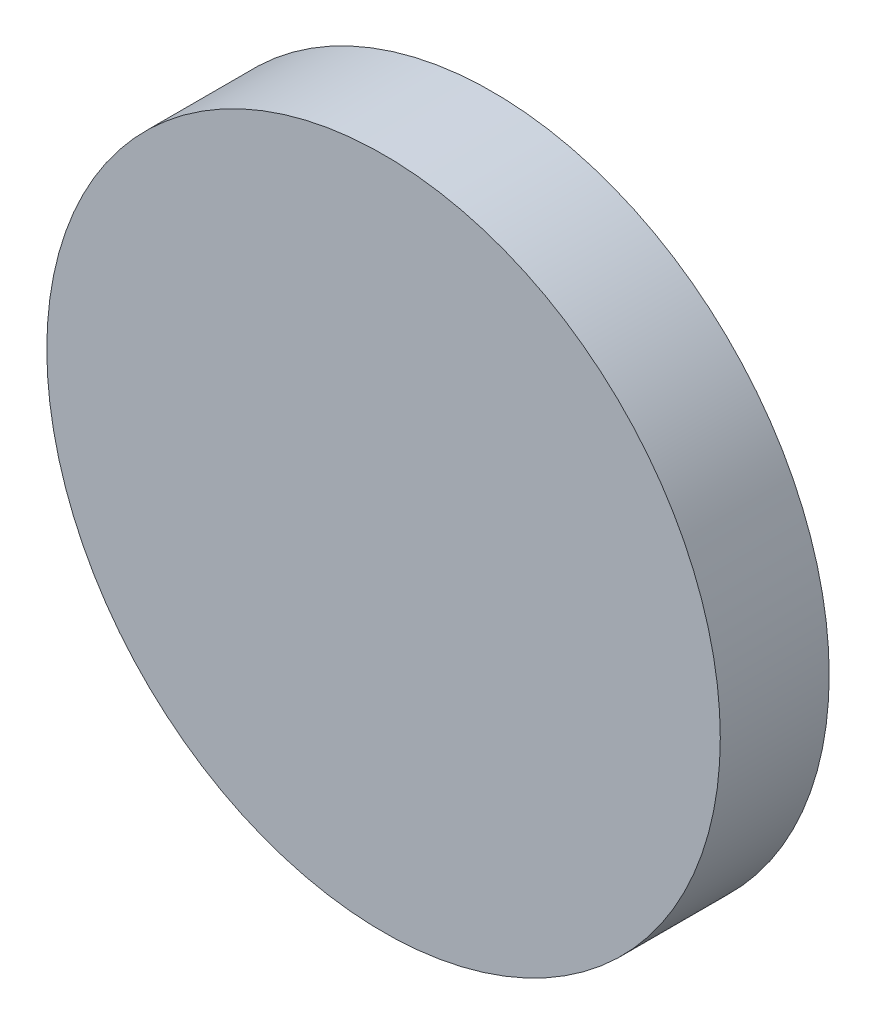
ISO-10303-21;
HEADER;
FILE_DESCRIPTION(('STEP AP214'),'2;1');
FILE_NAME('part.step','',(''),(''),'','','');
FILE_SCHEMA(('AUTOMOTIVE_DESIGN { 1 0 10303 214 1 1 1 1 }'));
ENDSEC;
DATA;
#1=APPLICATION_CONTEXT('core data for automotive mechanical design processes');
#2=APPLICATION_PROTOCOL_DEFINITION('international standard','automotive_design',2000,#1);
#3=PRODUCT_CONTEXT('',#1,'mechanical');
#4=PRODUCT('Part','Part','',(#3));
#5=PRODUCT_RELATED_PRODUCT_CATEGORY('part','',(#4));
#6=PRODUCT_DEFINITION_FORMATION('','',#4);
#7=PRODUCT_DEFINITION_CONTEXT('part definition',#1,'design');
#8=PRODUCT_DEFINITION('design','',#6,#7);
#9=PRODUCT_DEFINITION_SHAPE('','',#8);
#10=(LENGTH_UNIT() NAMED_UNIT(*) SI_UNIT(.MILLI.,.METRE.));
#11=(NAMED_UNIT(*) PLANE_ANGLE_UNIT() SI_UNIT($,.RADIAN.));
#12=(NAMED_UNIT(*) SI_UNIT($,.STERADIAN.) SOLID_ANGLE_UNIT());
#13=UNCERTAINTY_MEASURE_WITH_UNIT(LENGTH_MEASURE(1.E-05),#10,'distance_accuracy_value','');
#14=(GEOMETRIC_REPRESENTATION_CONTEXT(3) GLOBAL_UNCERTAINTY_ASSIGNED_CONTEXT((#13)) GLOBAL_UNIT_ASSIGNED_CONTEXT((#10,
#11,#12)) REPRESENTATION_CONTEXT('',''));
#15=CARTESIAN_POINT('',(0.,0.,0.));
#16=DIRECTION('',(0.,0.,1.));
#17=DIRECTION('',(1.,0.,0.));
#18=AXIS2_PLACEMENT_3D('',#15,#16,#17);
#19=CARTESIAN_POINT('',(0.,0.,15.494));
#20=DIRECTION('',(0.,0.,-1.));
#21=DIRECTION('',(-1.,0.,0.));
#22=AXIS2_PLACEMENT_3D('',#19,#20,#21);
#23=CYLINDRICAL_SURFACE('',#22,47.9141274948754);
#24=CARTESIAN_POINT('',(0.,0.,15.494));
#25=DIRECTION('',(0.,0.,1.));
#26=DIRECTION('',(1.,0.,0.));
#27=AXIS2_PLACEMENT_3D('',#24,#25,#26);
#28=CIRCLE('',#27,47.9141274948754);
#29=CARTESIAN_POINT('',(47.9141274948754,0.,15.494));
#30=VERTEX_POINT('',#29);
#31=EDGE_CURVE('E10',#30,#30,#28,.T.);
#32=ORIENTED_EDGE('',*,*,#31,.F.);
#33=EDGE_LOOP('',(#32));
#34=FACE_BOUND('',#33,.T.);
#35=CARTESIAN_POINT('',(0.,0.,0.));
#36=DIRECTION('',(0.,0.,1.));
#37=DIRECTION('',(1.,0.,0.));
#38=AXIS2_PLACEMENT_3D('',#35,#36,#37);
#39=CIRCLE('',#38,47.9141274948754);
#40=CARTESIAN_POINT('',(47.9141274948754,0.,0.));
#41=VERTEX_POINT('',#40);
#42=EDGE_CURVE('E38',#41,#41,#39,.T.);
#43=ORIENTED_EDGE('',*,*,#42,.T.);
#44=EDGE_LOOP('',(#43));
#45=FACE_BOUND('',#44,.T.);
#46=ADVANCED_FACE('F35',(#34,#45),#23,.T.);
#47=CARTESIAN_POINT('',(0.,0.,15.494));
#48=DIRECTION('',(0.,0.,1.));
#49=DIRECTION('',(1.,0.,0.));
#50=AXIS2_PLACEMENT_3D('',#47,#48,#49);
#51=PLANE('',#50);
#52=ORIENTED_EDGE('',*,*,#31,.T.);
#53=EDGE_LOOP('',(#52));
#54=FACE_BOUND('',#53,.T.);
#55=ADVANCED_FACE('F50',(#54),#51,.T.);
#56=CARTESIAN_POINT('',(0.,0.,0.));
#57=DIRECTION('',(0.,0.,1.));
#58=DIRECTION('',(1.,0.,0.));
#59=AXIS2_PLACEMENT_3D('',#56,#57,#58);
#60=PLANE('',#59);
#61=ORIENTED_EDGE('',*,*,#42,.F.);
#62=EDGE_LOOP('',(#61));
#63=FACE_BOUND('',#62,.T.);
#64=ADVANCED_FACE('F48',(#63),#60,.F.);
#65=CLOSED_SHELL('',(#46,#55,#64));
#66=MANIFOLD_SOLID_BREP('B2',#65);
#67=ADVANCED_BREP_SHAPE_REPRESENTATION('',(#18,#66),#14);
#68=SHAPE_DEFINITION_REPRESENTATION(#9,#67);
ENDSEC;
END-ISO-10303-21;
